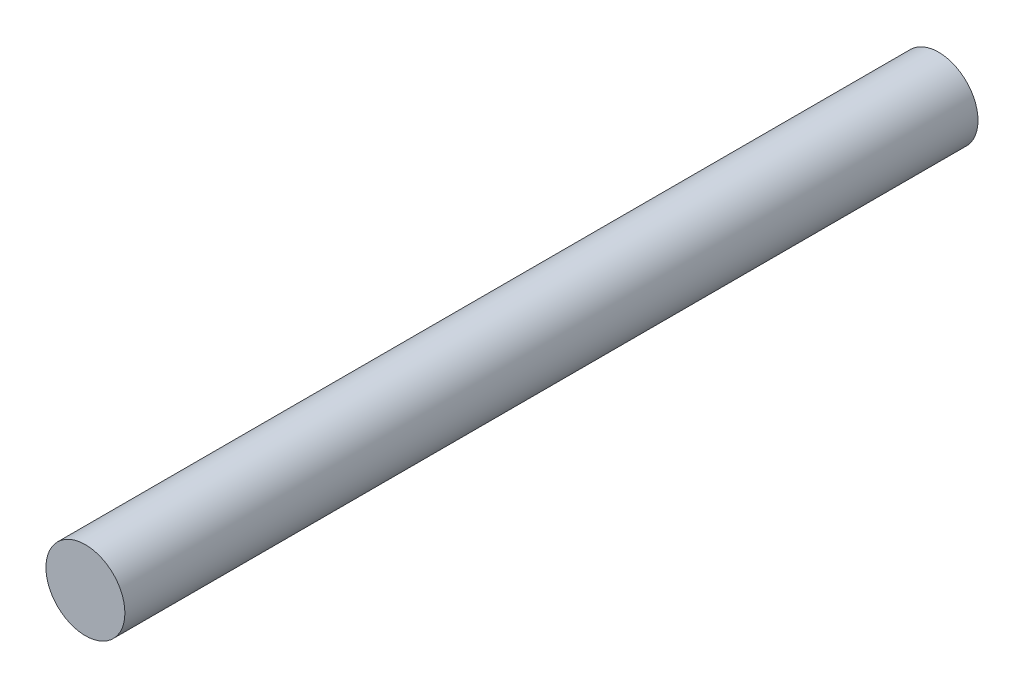
ISO-10303-21;
HEADER;
FILE_DESCRIPTION(('STEP AP214'),'2;1');
FILE_NAME('part.step','',(''),(''),'','','');
FILE_SCHEMA(('AUTOMOTIVE_DESIGN { 1 0 10303 214 1 1 1 1 }'));
ENDSEC;
DATA;
#1=APPLICATION_CONTEXT('core data for automotive mechanical design processes');
#2=APPLICATION_PROTOCOL_DEFINITION('international standard','automotive_design',2000,#1);
#3=PRODUCT_CONTEXT('',#1,'mechanical');
#4=PRODUCT('Part','Part','',(#3));
#5=PRODUCT_RELATED_PRODUCT_CATEGORY('part','',(#4));
#6=PRODUCT_DEFINITION_FORMATION('','',#4);
#7=PRODUCT_DEFINITION_CONTEXT('part definition',#1,'design');
#8=PRODUCT_DEFINITION('design','',#6,#7);
#9=PRODUCT_DEFINITION_SHAPE('','',#8);
#10=(LENGTH_UNIT() NAMED_UNIT(*) SI_UNIT(.MILLI.,.METRE.));
#11=(NAMED_UNIT(*) PLANE_ANGLE_UNIT() SI_UNIT($,.RADIAN.));
#12=(NAMED_UNIT(*) SI_UNIT($,.STERADIAN.) SOLID_ANGLE_UNIT());
#13=UNCERTAINTY_MEASURE_WITH_UNIT(LENGTH_MEASURE(1.E-05),#10,'distance_accuracy_value','');
#14=(GEOMETRIC_REPRESENTATION_CONTEXT(3) GLOBAL_UNCERTAINTY_ASSIGNED_CONTEXT((#13)) GLOBAL_UNIT_ASSIGNED_CONTEXT((#10,
#11,#12)) REPRESENTATION_CONTEXT('',''));
#15=CARTESIAN_POINT('',(0.,0.,0.));
#16=DIRECTION('',(0.,0.,1.));
#17=DIRECTION('',(1.,0.,0.));
#18=AXIS2_PLACEMENT_3D('',#15,#16,#17);
#19=CARTESIAN_POINT('',(0.,0.,21.5));
#20=DIRECTION('',(0.,0.,-1.));
#21=DIRECTION('',(-1.,0.,0.));
#22=AXIS2_PLACEMENT_3D('',#19,#20,#21);
#23=CYLINDRICAL_SURFACE('',#22,0.995);
#24=CARTESIAN_POINT('',(0.,0.,21.5));
#25=DIRECTION('',(0.,0.,1.));
#26=DIRECTION('',(1.,0.,0.));
#27=AXIS2_PLACEMENT_3D('',#24,#25,#26);
#28=CIRCLE('',#27,0.995);
#29=CARTESIAN_POINT('',(0.995,0.,21.5));
#30=VERTEX_POINT('',#29);
#31=EDGE_CURVE('E10',#30,#30,#28,.T.);
#32=ORIENTED_EDGE('',*,*,#31,.F.);
#33=EDGE_LOOP('',(#32));
#34=FACE_BOUND('',#33,.T.);
#35=CARTESIAN_POINT('',(0.,0.,0.));
#36=DIRECTION('',(0.,0.,1.));
#37=DIRECTION('',(1.,0.,0.));
#38=AXIS2_PLACEMENT_3D('',#35,#36,#37);
#39=CIRCLE('',#38,0.995);
#40=CARTESIAN_POINT('',(0.995,0.,0.));
#41=VERTEX_POINT('',#40);
#42=EDGE_CURVE('E34',#41,#41,#39,.T.);
#43=ORIENTED_EDGE('',*,*,#42,.T.);
#44=EDGE_LOOP('',(#43));
#45=FACE_BOUND('',#44,.T.);
#46=ADVANCED_FACE('F31',(#34,#45),#23,.T.);
#47=CARTESIAN_POINT('',(0.,0.,21.5));
#48=DIRECTION('',(0.,0.,1.));
#49=DIRECTION('',(1.,0.,0.));
#50=AXIS2_PLACEMENT_3D('',#47,#48,#49);
#51=PLANE('',#50);
#52=ORIENTED_EDGE('',*,*,#31,.T.);
#53=EDGE_LOOP('',(#52));
#54=FACE_BOUND('',#53,.T.);
#55=ADVANCED_FACE('F46',(#54),#51,.T.);
#56=CARTESIAN_POINT('',(0.,0.,0.));
#57=DIRECTION('',(0.,0.,1.));
#58=DIRECTION('',(1.,0.,0.));
#59=AXIS2_PLACEMENT_3D('',#56,#57,#58);
#60=PLANE('',#59);
#61=ORIENTED_EDGE('',*,*,#42,.F.);
#62=EDGE_LOOP('',(#61));
#63=FACE_BOUND('',#62,.T.);
#64=ADVANCED_FACE('F44',(#63),#60,.F.);
#65=CLOSED_SHELL('',(#46,#55,#64));
#66=MANIFOLD_SOLID_BREP('B2',#65);
#67=ADVANCED_BREP_SHAPE_REPRESENTATION('',(#18,#66),#14);
#68=SHAPE_DEFINITION_REPRESENTATION(#9,#67);
ENDSEC;
END-ISO-10303-21;
